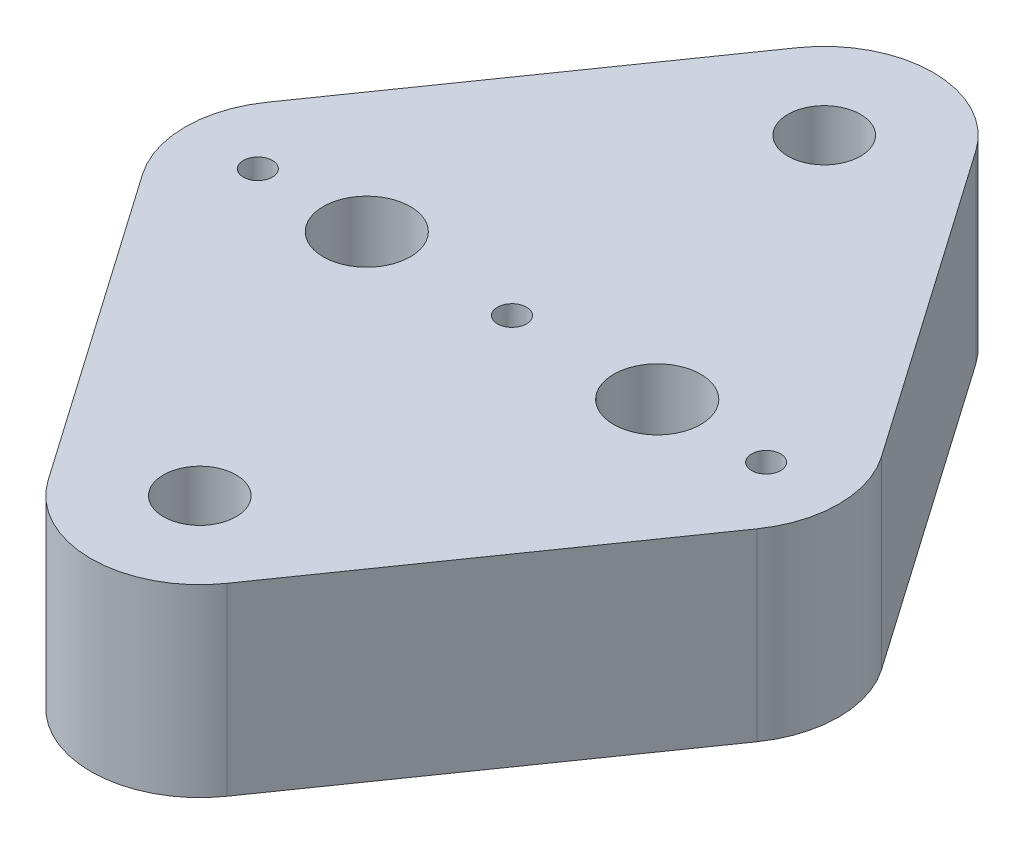
ISO-10303-21;
HEADER;
FILE_DESCRIPTION(('STEP AP214'),'2;1');
FILE_NAME('part.step','',(''),(''),'','','');
FILE_SCHEMA(('AUTOMOTIVE_DESIGN { 1 0 10303 214 1 1 1 1 }'));
ENDSEC;
DATA;
#1=APPLICATION_CONTEXT('core data for automotive mechanical design processes');
#2=APPLICATION_PROTOCOL_DEFINITION('international standard','automotive_design',2000,#1);
#3=PRODUCT_CONTEXT('',#1,'mechanical');
#4=PRODUCT('Part','Part','',(#3));
#5=PRODUCT_RELATED_PRODUCT_CATEGORY('part','',(#4));
#6=PRODUCT_DEFINITION_FORMATION('','',#4);
#7=PRODUCT_DEFINITION_CONTEXT('part definition',#1,'design');
#8=PRODUCT_DEFINITION('design','',#6,#7);
#9=PRODUCT_DEFINITION_SHAPE('','',#8);
#10=(LENGTH_UNIT() NAMED_UNIT(*) SI_UNIT(.MILLI.,.METRE.));
#11=(NAMED_UNIT(*) PLANE_ANGLE_UNIT() SI_UNIT($,.RADIAN.));
#12=(NAMED_UNIT(*) SI_UNIT($,.STERADIAN.) SOLID_ANGLE_UNIT());
#13=UNCERTAINTY_MEASURE_WITH_UNIT(LENGTH_MEASURE(1.E-05),#10,'distance_accuracy_value','');
#14=(GEOMETRIC_REPRESENTATION_CONTEXT(3) GLOBAL_UNCERTAINTY_ASSIGNED_CONTEXT((#13)) GLOBAL_UNIT_ASSIGNED_CONTEXT((#10,
#11,#12)) REPRESENTATION_CONTEXT('',''));
#15=CARTESIAN_POINT('',(0.,0.,0.));
#16=DIRECTION('',(0.,0.,1.));
#17=DIRECTION('',(1.,0.,0.));
#18=AXIS2_PLACEMENT_3D('',#15,#16,#17);
#19=CARTESIAN_POINT('',(0.,6.35,21.5));
#20=DIRECTION('',(0.,-1.,0.));
#21=DIRECTION('',(0.,0.,-1.));
#22=AXIS2_PLACEMENT_3D('',#19,#20,#21);
#23=PLANE('',#22);
#24=CARTESIAN_POINT('',(-17.5,6.35,0.));
#25=DIRECTION('',(0.,1.,0.));
#26=DIRECTION('',(0.,0.,1.));
#27=AXIS2_PLACEMENT_3D('',#24,#25,#26);
#28=CIRCLE('',#27,1.);
#29=CARTESIAN_POINT('',(-17.5,6.35,1.));
#30=VERTEX_POINT('',#29);
#31=EDGE_CURVE('E214',#30,#30,#28,.T.);
#32=ORIENTED_EDGE('',*,*,#31,.F.);
#33=EDGE_LOOP('',(#32));
#34=FACE_BOUND('',#33,.T.);
#35=CARTESIAN_POINT('',(17.5,6.35,0.));
#36=DIRECTION('',(0.,1.,0.));
#37=DIRECTION('',(0.,0.,1.));
#38=AXIS2_PLACEMENT_3D('',#35,#36,#37);
#39=CIRCLE('',#38,1.);
#40=CARTESIAN_POINT('',(17.5,6.35,1.));
#41=VERTEX_POINT('',#40);
#42=EDGE_CURVE('E208',#41,#41,#39,.T.);
#43=ORIENTED_EDGE('',*,*,#42,.F.);
#44=EDGE_LOOP('',(#43));
#45=FACE_BOUND('',#44,.T.);
#46=CARTESIAN_POINT('',(0.,6.35,0.));
#47=DIRECTION('',(0.,1.,0.));
#48=DIRECTION('',(0.,0.,1.));
#49=AXIS2_PLACEMENT_3D('',#46,#47,#48);
#50=CIRCLE('',#49,1.);
#51=CARTESIAN_POINT('',(0.,6.35,1.));
#52=VERTEX_POINT('',#51);
#53=EDGE_CURVE('E202',#52,#52,#50,.T.);
#54=ORIENTED_EDGE('',*,*,#53,.F.);
#55=EDGE_LOOP('',(#54));
#56=FACE_BOUND('',#55,.T.);
#57=CARTESIAN_POINT('',(0.,6.35,21.5));
#58=DIRECTION('',(0.,1.,0.));
#59=DIRECTION('',(0.,0.,-1.));
#60=AXIS2_PLACEMENT_3D('',#57,#58,#59);
#61=CIRCLE('',#60,7.5);
#62=CARTESIAN_POINT('',(-6.15095215725888,6.35,25.7913619701806));
#63=VERTEX_POINT('',#62);
#64=CARTESIAN_POINT('',(6.15095215725888,6.35,25.7913619701806));
#65=VERTEX_POINT('',#64);
#66=EDGE_CURVE('E144',#63,#65,#61,.T.);
#67=ORIENTED_EDGE('',*,*,#66,.T.);
#68=DIRECTION('',(0.572181596024081,0.,-0.820126954301183));
#69=VECTOR('',#68,1.);
#70=CARTESIAN_POINT('',(21.1509521572589,6.35,4.29136197018061));
#71=LINE('',#70,#69);
#72=CARTESIAN_POINT('',(21.1509521572589,6.35,4.29136197018061));
#73=VERTEX_POINT('',#72);
#74=EDGE_CURVE('E92',#65,#73,#71,.T.);
#75=ORIENTED_EDGE('',*,*,#74,.T.);
#76=CARTESIAN_POINT('',(15.,6.35,0.));
#77=DIRECTION('',(0.,1.,0.));
#78=DIRECTION('',(0.,0.,1.));
#79=AXIS2_PLACEMENT_3D('',#76,#77,#78);
#80=CIRCLE('',#79,7.5);
#81=CARTESIAN_POINT('',(21.1509521572589,6.35,-4.29136197018061));
#82=VERTEX_POINT('',#81);
#83=EDGE_CURVE('E159',#73,#82,#80,.T.);
#84=ORIENTED_EDGE('',*,*,#83,.T.);
#85=DIRECTION('',(-0.572181596024081,0.,-0.820126954301183));
#86=VECTOR('',#85,1.);
#87=CARTESIAN_POINT('',(6.15095215725888,6.35,-25.7913619701806));
#88=LINE('',#87,#86);
#89=CARTESIAN_POINT('',(6.15095215725888,6.35,-25.7913619701806));
#90=VERTEX_POINT('',#89);
#91=EDGE_CURVE('E172',#82,#90,#88,.T.);
#92=ORIENTED_EDGE('',*,*,#91,.T.);
#93=CARTESIAN_POINT('',(0.,6.35,-21.5));
#94=DIRECTION('',(0.,1.,0.));
#95=DIRECTION('',(0.,0.,-1.));
#96=AXIS2_PLACEMENT_3D('',#93,#94,#95);
#97=CIRCLE('',#96,7.5);
#98=CARTESIAN_POINT('',(-6.15095215725888,6.35,-25.7913619701806));
#99=VERTEX_POINT('',#98);
#100=EDGE_CURVE('E111',#90,#99,#97,.T.);
#101=ORIENTED_EDGE('',*,*,#100,.T.);
#102=DIRECTION('',(-0.572181596024081,0.,0.820126954301183));
#103=VECTOR('',#102,1.);
#104=CARTESIAN_POINT('',(-21.1509521572589,6.35,-4.29136197018061));
#105=LINE('',#104,#103);
#106=CARTESIAN_POINT('',(-21.1509521572589,6.35,-4.29136197018061));
#107=VERTEX_POINT('',#106);
#108=EDGE_CURVE('E105',#99,#107,#105,.T.);
#109=ORIENTED_EDGE('',*,*,#108,.T.);
#110=CARTESIAN_POINT('',(-15.,6.35,0.));
#111=DIRECTION('',(0.,1.,0.));
#112=DIRECTION('',(0.,0.,-1.));
#113=AXIS2_PLACEMENT_3D('',#110,#111,#112);
#114=CIRCLE('',#113,7.5);
#115=CARTESIAN_POINT('',(-21.1509521572589,6.35,4.29136197018061));
#116=VERTEX_POINT('',#115);
#117=EDGE_CURVE('E109',#107,#116,#114,.T.);
#118=ORIENTED_EDGE('',*,*,#117,.T.);
#119=DIRECTION('',(0.572181596024081,0.,0.820126954301183));
#120=VECTOR('',#119,1.);
#121=CARTESIAN_POINT('',(-6.15095215725888,6.35,25.7913619701806));
#122=LINE('',#121,#120);
#123=EDGE_CURVE('E49',#116,#63,#122,.T.);
#124=ORIENTED_EDGE('',*,*,#123,.T.);
#125=EDGE_LOOP('',(#67,#75,#84,#92,#101,#109,#118,#124));
#126=FACE_BOUND('',#125,.T.);
#127=CARTESIAN_POINT('',(0.,6.35,-21.5));
#128=DIRECTION('',(0.,1.,0.));
#129=DIRECTION('',(0.,0.,1.));
#130=AXIS2_PLACEMENT_3D('',#127,#128,#129);
#131=CIRCLE('',#130,2.5);
#132=CARTESIAN_POINT('',(0.,6.35,-19.));
#133=VERTEX_POINT('',#132);
#134=EDGE_CURVE('E133',#133,#133,#131,.T.);
#135=ORIENTED_EDGE('',*,*,#134,.F.);
#136=EDGE_LOOP('',(#135));
#137=FACE_BOUND('',#136,.T.);
#138=CARTESIAN_POINT('',(0.,6.35,21.5));
#139=DIRECTION('',(0.,1.,0.));
#140=DIRECTION('',(0.,0.,1.));
#141=AXIS2_PLACEMENT_3D('',#138,#139,#140);
#142=CIRCLE('',#141,2.5);
#143=CARTESIAN_POINT('',(0.,6.35,24.));
#144=VERTEX_POINT('',#143);
#145=EDGE_CURVE('E181',#144,#144,#142,.T.);
#146=ORIENTED_EDGE('',*,*,#145,.F.);
#147=EDGE_LOOP('',(#146));
#148=FACE_BOUND('',#147,.T.);
#149=CARTESIAN_POINT('',(-10.,6.35,0.));
#150=DIRECTION('',(0.,1.,0.));
#151=DIRECTION('',(0.,0.,1.));
#152=AXIS2_PLACEMENT_3D('',#149,#150,#151);
#153=CIRCLE('',#152,3.);
#154=CARTESIAN_POINT('',(-10.,6.35,3.));
#155=VERTEX_POINT('',#154);
#156=EDGE_CURVE('E187',#155,#155,#153,.T.);
#157=ORIENTED_EDGE('',*,*,#156,.F.);
#158=EDGE_LOOP('',(#157));
#159=FACE_BOUND('',#158,.T.);
#160=CARTESIAN_POINT('',(10.,6.35,0.));
#161=DIRECTION('',(0.,1.,0.));
#162=DIRECTION('',(0.,0.,1.));
#163=AXIS2_PLACEMENT_3D('',#160,#161,#162);
#164=CIRCLE('',#163,3.);
#165=CARTESIAN_POINT('',(10.,6.35,3.));
#166=VERTEX_POINT('',#165);
#167=EDGE_CURVE('E193',#166,#166,#164,.T.);
#168=ORIENTED_EDGE('',*,*,#167,.F.);
#169=EDGE_LOOP('',(#168));
#170=FACE_BOUND('',#169,.T.);
#171=ADVANCED_FACE('F32',(#34,#45,#56,#126,#137,#148,#159,#170),#23,.F.);
#172=CARTESIAN_POINT('',(0.,-6.35,21.5));
#173=DIRECTION('',(0.,-1.,0.));
#174=DIRECTION('',(0.,0.,-1.));
#175=AXIS2_PLACEMENT_3D('',#172,#173,#174);
#176=PLANE('',#175);
#177=CARTESIAN_POINT('',(-17.5,-6.35,0.));
#178=DIRECTION('',(0.,1.,0.));
#179=DIRECTION('',(0.,0.,1.));
#180=AXIS2_PLACEMENT_3D('',#177,#178,#179);
#181=CIRCLE('',#180,1.);
#182=CARTESIAN_POINT('',(-17.5,-6.35,1.));
#183=VERTEX_POINT('',#182);
#184=EDGE_CURVE('E199',#183,#183,#181,.T.);
#185=ORIENTED_EDGE('',*,*,#184,.T.);
#186=EDGE_LOOP('',(#185));
#187=FACE_BOUND('',#186,.T.);
#188=CARTESIAN_POINT('',(17.5,-6.35,0.));
#189=DIRECTION('',(0.,1.,0.));
#190=DIRECTION('',(0.,0.,1.));
#191=AXIS2_PLACEMENT_3D('',#188,#189,#190);
#192=CIRCLE('',#191,1.);
#193=CARTESIAN_POINT('',(17.5,-6.35,1.));
#194=VERTEX_POINT('',#193);
#195=EDGE_CURVE('E211',#194,#194,#192,.T.);
#196=ORIENTED_EDGE('',*,*,#195,.T.);
#197=EDGE_LOOP('',(#196));
#198=FACE_BOUND('',#197,.T.);
#199=CARTESIAN_POINT('',(0.,-6.35,0.));
#200=DIRECTION('',(0.,1.,0.));
#201=DIRECTION('',(0.,0.,1.));
#202=AXIS2_PLACEMENT_3D('',#199,#200,#201);
#203=CIRCLE('',#202,1.);
#204=CARTESIAN_POINT('',(0.,-6.35,1.));
#205=VERTEX_POINT('',#204);
#206=EDGE_CURVE('E205',#205,#205,#203,.T.);
#207=ORIENTED_EDGE('',*,*,#206,.T.);
#208=EDGE_LOOP('',(#207));
#209=FACE_BOUND('',#208,.T.);
#210=CARTESIAN_POINT('',(-10.,-6.35,0.));
#211=DIRECTION('',(0.,1.,0.));
#212=DIRECTION('',(0.,0.,1.));
#213=AXIS2_PLACEMENT_3D('',#210,#211,#212);
#214=CIRCLE('',#213,3.);
#215=CARTESIAN_POINT('',(-10.,-6.35,3.));
#216=VERTEX_POINT('',#215);
#217=EDGE_CURVE('E190',#216,#216,#214,.T.);
#218=ORIENTED_EDGE('',*,*,#217,.T.);
#219=EDGE_LOOP('',(#218));
#220=FACE_BOUND('',#219,.T.);
#221=CARTESIAN_POINT('',(0.,-6.35,-21.5));
#222=DIRECTION('',(0.,1.,0.));
#223=DIRECTION('',(0.,0.,1.));
#224=AXIS2_PLACEMENT_3D('',#221,#222,#223);
#225=CIRCLE('',#224,2.5);
#226=CARTESIAN_POINT('',(0.,-6.35,-19.));
#227=VERTEX_POINT('',#226);
#228=EDGE_CURVE('E178',#227,#227,#225,.T.);
#229=ORIENTED_EDGE('',*,*,#228,.T.);
#230=EDGE_LOOP('',(#229));
#231=FACE_BOUND('',#230,.T.);
#232=CARTESIAN_POINT('',(0.,-6.35,21.5));
#233=DIRECTION('',(0.,1.,0.));
#234=DIRECTION('',(0.,0.,-1.));
#235=AXIS2_PLACEMENT_3D('',#232,#233,#234);
#236=CIRCLE('',#235,7.5);
#237=CARTESIAN_POINT('',(-6.15095215725888,-6.35,25.7913619701806));
#238=VERTEX_POINT('',#237);
#239=CARTESIAN_POINT('',(6.15095215725888,-6.35,25.7913619701806));
#240=VERTEX_POINT('',#239);
#241=EDGE_CURVE('E129',#238,#240,#236,.T.);
#242=ORIENTED_EDGE('',*,*,#241,.F.);
#243=DIRECTION('',(0.572181596024081,0.,0.820126954301183));
#244=VECTOR('',#243,1.);
#245=CARTESIAN_POINT('',(-6.15095215725888,-6.35,25.7913619701806));
#246=LINE('',#245,#244);
#247=CARTESIAN_POINT('',(-21.1509521572589,-6.35,4.29136197018061));
#248=VERTEX_POINT('',#247);
#249=EDGE_CURVE('E84',#248,#238,#246,.T.);
#250=ORIENTED_EDGE('',*,*,#249,.F.);
#251=CARTESIAN_POINT('',(-15.,-6.35,0.));
#252=DIRECTION('',(0.,1.,0.));
#253=DIRECTION('',(0.,0.,-1.));
#254=AXIS2_PLACEMENT_3D('',#251,#252,#253);
#255=CIRCLE('',#254,7.5);
#256=CARTESIAN_POINT('',(-21.1509521572589,-6.35,-4.29136197018061));
#257=VERTEX_POINT('',#256);
#258=EDGE_CURVE('E78',#257,#248,#255,.T.);
#259=ORIENTED_EDGE('',*,*,#258,.F.);
#260=DIRECTION('',(-0.572181596024081,0.,0.820126954301183));
#261=VECTOR('',#260,1.);
#262=CARTESIAN_POINT('',(-21.1509521572589,-6.35,-4.29136197018061));
#263=LINE('',#262,#261);
#264=CARTESIAN_POINT('',(-6.15095215725888,-6.35,-25.7913619701806));
#265=VERTEX_POINT('',#264);
#266=EDGE_CURVE('E119',#265,#257,#263,.T.);
#267=ORIENTED_EDGE('',*,*,#266,.F.);
#268=CARTESIAN_POINT('',(0.,-6.35,-21.5));
#269=DIRECTION('',(0.,1.,0.));
#270=DIRECTION('',(0.,0.,-1.));
#271=AXIS2_PLACEMENT_3D('',#268,#269,#270);
#272=CIRCLE('',#271,7.5);
#273=CARTESIAN_POINT('',(6.15095215725888,-6.35,-25.7913619701806));
#274=VERTEX_POINT('',#273);
#275=EDGE_CURVE('E139',#274,#265,#272,.T.);
#276=ORIENTED_EDGE('',*,*,#275,.F.);
#277=DIRECTION('',(-0.572181596024081,0.,-0.820126954301183));
#278=VECTOR('',#277,1.);
#279=CARTESIAN_POINT('',(6.15095215725888,-6.35,-25.7913619701806));
#280=LINE('',#279,#278);
#281=CARTESIAN_POINT('',(21.1509521572589,-6.35,-4.29136197018061));
#282=VERTEX_POINT('',#281);
#283=EDGE_CURVE('E137',#282,#274,#280,.T.);
#284=ORIENTED_EDGE('',*,*,#283,.F.);
#285=CARTESIAN_POINT('',(15.,-6.35,0.));
#286=DIRECTION('',(0.,1.,0.));
#287=DIRECTION('',(0.,0.,1.));
#288=AXIS2_PLACEMENT_3D('',#285,#286,#287);
#289=CIRCLE('',#288,7.5);
#290=CARTESIAN_POINT('',(21.1509521572589,-6.35,4.29136197018061));
#291=VERTEX_POINT('',#290);
#292=EDGE_CURVE('E135',#291,#282,#289,.T.);
#293=ORIENTED_EDGE('',*,*,#292,.F.);
#294=DIRECTION('',(0.572181596024081,0.,-0.820126954301183));
#295=VECTOR('',#294,1.);
#296=CARTESIAN_POINT('',(21.1509521572589,-6.35,4.29136197018061));
#297=LINE('',#296,#295);
#298=EDGE_CURVE('E132',#240,#291,#297,.T.);
#299=ORIENTED_EDGE('',*,*,#298,.F.);
#300=EDGE_LOOP('',(#242,#250,#259,#267,#276,#284,#293,#299));
#301=FACE_BOUND('',#300,.T.);
#302=CARTESIAN_POINT('',(0.,-6.35,21.5));
#303=DIRECTION('',(0.,1.,0.));
#304=DIRECTION('',(0.,0.,1.));
#305=AXIS2_PLACEMENT_3D('',#302,#303,#304);
#306=CIRCLE('',#305,2.5);
#307=CARTESIAN_POINT('',(0.,-6.35,24.));
#308=VERTEX_POINT('',#307);
#309=EDGE_CURVE('E184',#308,#308,#306,.T.);
#310=ORIENTED_EDGE('',*,*,#309,.T.);
#311=EDGE_LOOP('',(#310));
#312=FACE_BOUND('',#311,.T.);
#313=CARTESIAN_POINT('',(10.,-6.35,0.));
#314=DIRECTION('',(0.,1.,0.));
#315=DIRECTION('',(0.,0.,1.));
#316=AXIS2_PLACEMENT_3D('',#313,#314,#315);
#317=CIRCLE('',#316,3.);
#318=CARTESIAN_POINT('',(10.,-6.35,3.));
#319=VERTEX_POINT('',#318);
#320=EDGE_CURVE('E196',#319,#319,#317,.T.);
#321=ORIENTED_EDGE('',*,*,#320,.T.);
#322=EDGE_LOOP('',(#321));
#323=FACE_BOUND('',#322,.T.);
#324=ADVANCED_FACE('F163',(#187,#198,#209,#220,#231,#301,#312,#323),#176,.T.);
#325=CARTESIAN_POINT('',(0.,6.35,21.5));
#326=DIRECTION('',(0.,-1.,0.));
#327=DIRECTION('',(0.,0.,-1.));
#328=AXIS2_PLACEMENT_3D('',#325,#326,#327);
#329=CYLINDRICAL_SURFACE('',#328,7.5);
#330=ORIENTED_EDGE('',*,*,#241,.T.);
#331=DIRECTION('',(0.,-1.,0.));
#332=VECTOR('',#331,1.);
#333=CARTESIAN_POINT('',(6.15095215725888,6.35,25.7913619701806));
#334=LINE('',#333,#332);
#335=EDGE_CURVE('E11',#65,#240,#334,.T.);
#336=ORIENTED_EDGE('',*,*,#335,.F.);
#337=ORIENTED_EDGE('',*,*,#66,.F.);
#338=DIRECTION('',(0.,-1.,0.));
#339=VECTOR('',#338,1.);
#340=CARTESIAN_POINT('',(-6.15095215725888,6.35,25.7913619701806));
#341=LINE('',#340,#339);
#342=EDGE_CURVE('E125',#63,#238,#341,.T.);
#343=ORIENTED_EDGE('',*,*,#342,.T.);
#344=EDGE_LOOP('',(#330,#336,#337,#343));
#345=FACE_BOUND('',#344,.T.);
#346=ADVANCED_FACE('F34',(#345),#329,.T.);
#347=CARTESIAN_POINT('',(21.1509521572589,6.35,4.29136197018061));
#348=DIRECTION('',(-0.820126954301183,0.,-0.572181596024081));
#349=DIRECTION('',(-0.572181596024081,0.,0.820126954301183));
#350=AXIS2_PLACEMENT_3D('',#347,#348,#349);
#351=PLANE('',#350);
#352=ORIENTED_EDGE('',*,*,#298,.T.);
#353=DIRECTION('',(0.,-1.,0.));
#354=VECTOR('',#353,1.);
#355=CARTESIAN_POINT('',(21.1509521572589,6.35,4.29136197018061));
#356=LINE('',#355,#354);
#357=EDGE_CURVE('E41',#73,#291,#356,.T.);
#358=ORIENTED_EDGE('',*,*,#357,.F.);
#359=ORIENTED_EDGE('',*,*,#74,.F.);
#360=ORIENTED_EDGE('',*,*,#335,.T.);
#361=EDGE_LOOP('',(#352,#358,#359,#360));
#362=FACE_BOUND('',#361,.T.);
#363=ADVANCED_FACE('F277',(#362),#351,.F.);
#364=CARTESIAN_POINT('',(15.,6.35,0.));
#365=DIRECTION('',(0.,-1.,0.));
#366=DIRECTION('',(0.,0.,-1.));
#367=AXIS2_PLACEMENT_3D('',#364,#365,#366);
#368=CYLINDRICAL_SURFACE('',#367,7.5);
#369=ORIENTED_EDGE('',*,*,#292,.T.);
#370=DIRECTION('',(0.,-1.,0.));
#371=VECTOR('',#370,1.);
#372=CARTESIAN_POINT('',(21.1509521572589,6.35,-4.29136197018061));
#373=LINE('',#372,#371);
#374=EDGE_CURVE('E151',#82,#282,#373,.T.);
#375=ORIENTED_EDGE('',*,*,#374,.F.);
#376=ORIENTED_EDGE('',*,*,#83,.F.);
#377=ORIENTED_EDGE('',*,*,#357,.T.);
#378=EDGE_LOOP('',(#369,#375,#376,#377));
#379=FACE_BOUND('',#378,.T.);
#380=ADVANCED_FACE('F157',(#379),#368,.T.);
#381=CARTESIAN_POINT('',(6.15095215725888,6.35,-25.7913619701806));
#382=DIRECTION('',(-0.820126954301183,0.,0.572181596024081));
#383=DIRECTION('',(0.572181596024081,0.,0.820126954301183));
#384=AXIS2_PLACEMENT_3D('',#381,#382,#383);
#385=PLANE('',#384);
#386=ORIENTED_EDGE('',*,*,#283,.T.);
#387=DIRECTION('',(0.,-1.,0.));
#388=VECTOR('',#387,1.);
#389=CARTESIAN_POINT('',(6.15095215725888,6.35,-25.7913619701806));
#390=LINE('',#389,#388);
#391=EDGE_CURVE('E148',#90,#274,#390,.T.);
#392=ORIENTED_EDGE('',*,*,#391,.F.);
#393=ORIENTED_EDGE('',*,*,#91,.F.);
#394=ORIENTED_EDGE('',*,*,#374,.T.);
#395=EDGE_LOOP('',(#386,#392,#393,#394));
#396=FACE_BOUND('',#395,.T.);
#397=ADVANCED_FACE('F168',(#396),#385,.F.);
#398=CARTESIAN_POINT('',(0.,6.35,-21.5));
#399=DIRECTION('',(0.,-1.,0.));
#400=DIRECTION('',(0.,0.,-1.));
#401=AXIS2_PLACEMENT_3D('',#398,#399,#400);
#402=CYLINDRICAL_SURFACE('',#401,7.5);
#403=ORIENTED_EDGE('',*,*,#275,.T.);
#404=DIRECTION('',(0.,-1.,0.));
#405=VECTOR('',#404,1.);
#406=CARTESIAN_POINT('',(-6.15095215725888,6.35,-25.7913619701806));
#407=LINE('',#406,#405);
#408=EDGE_CURVE('E120',#99,#265,#407,.T.);
#409=ORIENTED_EDGE('',*,*,#408,.F.);
#410=ORIENTED_EDGE('',*,*,#100,.F.);
#411=ORIENTED_EDGE('',*,*,#391,.T.);
#412=EDGE_LOOP('',(#403,#409,#410,#411));
#413=FACE_BOUND('',#412,.T.);
#414=ADVANCED_FACE('F171',(#413),#402,.T.);
#415=CARTESIAN_POINT('',(-21.1509521572589,6.35,-4.29136197018061));
#416=DIRECTION('',(0.820126954301183,0.,0.572181596024081));
#417=DIRECTION('',(0.572181596024081,0.,-0.820126954301183));
#418=AXIS2_PLACEMENT_3D('',#415,#416,#417);
#419=PLANE('',#418);
#420=ORIENTED_EDGE('',*,*,#266,.T.);
#421=DIRECTION('',(0.,-1.,0.));
#422=VECTOR('',#421,1.);
#423=CARTESIAN_POINT('',(-21.1509521572589,6.35,-4.29136197018061));
#424=LINE('',#423,#422);
#425=EDGE_CURVE('E116',#107,#257,#424,.T.);
#426=ORIENTED_EDGE('',*,*,#425,.F.);
#427=ORIENTED_EDGE('',*,*,#108,.F.);
#428=ORIENTED_EDGE('',*,*,#408,.T.);
#429=EDGE_LOOP('',(#420,#426,#427,#428));
#430=FACE_BOUND('',#429,.T.);
#431=ADVANCED_FACE('F117',(#430),#419,.F.);
#432=CARTESIAN_POINT('',(-15.,6.35,0.));
#433=DIRECTION('',(0.,-1.,0.));
#434=DIRECTION('',(0.,0.,-1.));
#435=AXIS2_PLACEMENT_3D('',#432,#433,#434);
#436=CYLINDRICAL_SURFACE('',#435,7.5);
#437=ORIENTED_EDGE('',*,*,#258,.T.);
#438=DIRECTION('',(0.,-1.,0.));
#439=VECTOR('',#438,1.);
#440=CARTESIAN_POINT('',(-21.1509521572589,6.35,4.29136197018061));
#441=LINE('',#440,#439);
#442=EDGE_CURVE('E121',#116,#248,#441,.T.);
#443=ORIENTED_EDGE('',*,*,#442,.F.);
#444=ORIENTED_EDGE('',*,*,#117,.F.);
#445=ORIENTED_EDGE('',*,*,#425,.T.);
#446=EDGE_LOOP('',(#437,#443,#444,#445));
#447=FACE_BOUND('',#446,.T.);
#448=ADVANCED_FACE('F123',(#447),#436,.T.);
#449=CARTESIAN_POINT('',(-6.15095215725888,6.35,25.7913619701806));
#450=DIRECTION('',(0.820126954301183,0.,-0.572181596024081));
#451=DIRECTION('',(-0.572181596024081,0.,-0.820126954301183));
#452=AXIS2_PLACEMENT_3D('',#449,#450,#451);
#453=PLANE('',#452);
#454=ORIENTED_EDGE('',*,*,#249,.T.);
#455=ORIENTED_EDGE('',*,*,#342,.F.);
#456=ORIENTED_EDGE('',*,*,#123,.F.);
#457=ORIENTED_EDGE('',*,*,#442,.T.);
#458=EDGE_LOOP('',(#454,#455,#456,#457));
#459=FACE_BOUND('',#458,.T.);
#460=ADVANCED_FACE('F261',(#459),#453,.F.);
#461=CARTESIAN_POINT('',(0.,6.35,-21.5));
#462=DIRECTION('',(0.,-1.,0.));
#463=DIRECTION('',(0.,0.,-1.));
#464=AXIS2_PLACEMENT_3D('',#461,#462,#463);
#465=CYLINDRICAL_SURFACE('',#464,2.5);
#466=ORIENTED_EDGE('',*,*,#134,.T.);
#467=EDGE_LOOP('',(#466));
#468=FACE_BOUND('',#467,.T.);
#469=ORIENTED_EDGE('',*,*,#228,.F.);
#470=EDGE_LOOP('',(#469));
#471=FACE_BOUND('',#470,.T.);
#472=ADVANCED_FACE('F258',(#468,#471),#465,.F.);
#473=CARTESIAN_POINT('',(0.,6.35,21.5));
#474=DIRECTION('',(0.,-1.,0.));
#475=DIRECTION('',(0.,0.,-1.));
#476=AXIS2_PLACEMENT_3D('',#473,#474,#475);
#477=CYLINDRICAL_SURFACE('',#476,2.5);
#478=ORIENTED_EDGE('',*,*,#145,.T.);
#479=EDGE_LOOP('',(#478));
#480=FACE_BOUND('',#479,.T.);
#481=ORIENTED_EDGE('',*,*,#309,.F.);
#482=EDGE_LOOP('',(#481));
#483=FACE_BOUND('',#482,.T.);
#484=ADVANCED_FACE('F254',(#480,#483),#477,.F.);
#485=CARTESIAN_POINT('',(-10.,6.35,0.));
#486=DIRECTION('',(0.,-1.,0.));
#487=DIRECTION('',(0.,0.,-1.));
#488=AXIS2_PLACEMENT_3D('',#485,#486,#487);
#489=CYLINDRICAL_SURFACE('',#488,3.);
#490=ORIENTED_EDGE('',*,*,#156,.T.);
#491=EDGE_LOOP('',(#490));
#492=FACE_BOUND('',#491,.T.);
#493=ORIENTED_EDGE('',*,*,#217,.F.);
#494=EDGE_LOOP('',(#493));
#495=FACE_BOUND('',#494,.T.);
#496=ADVANCED_FACE('F247',(#492,#495),#489,.F.);
#497=CARTESIAN_POINT('',(10.,6.35,0.));
#498=DIRECTION('',(0.,-1.,0.));
#499=DIRECTION('',(0.,0.,-1.));
#500=AXIS2_PLACEMENT_3D('',#497,#498,#499);
#501=CYLINDRICAL_SURFACE('',#500,3.);
#502=ORIENTED_EDGE('',*,*,#167,.T.);
#503=EDGE_LOOP('',(#502));
#504=FACE_BOUND('',#503,.T.);
#505=ORIENTED_EDGE('',*,*,#320,.F.);
#506=EDGE_LOOP('',(#505));
#507=FACE_BOUND('',#506,.T.);
#508=ADVANCED_FACE('F238',(#504,#507),#501,.F.);
#509=CARTESIAN_POINT('',(0.,-6.35,0.));
#510=DIRECTION('',(0.,1.,0.));
#511=DIRECTION('',(0.,0.,1.));
#512=AXIS2_PLACEMENT_3D('',#509,#510,#511);
#513=CYLINDRICAL_SURFACE('',#512,1.);
#514=ORIENTED_EDGE('',*,*,#206,.F.);
#515=EDGE_LOOP('',(#514));
#516=FACE_BOUND('',#515,.T.);
#517=ORIENTED_EDGE('',*,*,#53,.T.);
#518=EDGE_LOOP('',(#517));
#519=FACE_BOUND('',#518,.T.);
#520=ADVANCED_FACE('F236',(#516,#519),#513,.F.);
#521=CARTESIAN_POINT('',(17.5,-6.35,0.));
#522=DIRECTION('',(0.,1.,0.));
#523=DIRECTION('',(0.,0.,1.));
#524=AXIS2_PLACEMENT_3D('',#521,#522,#523);
#525=CYLINDRICAL_SURFACE('',#524,1.);
#526=ORIENTED_EDGE('',*,*,#195,.F.);
#527=EDGE_LOOP('',(#526));
#528=FACE_BOUND('',#527,.T.);
#529=ORIENTED_EDGE('',*,*,#42,.T.);
#530=EDGE_LOOP('',(#529));
#531=FACE_BOUND('',#530,.T.);
#532=ADVANCED_FACE('F225',(#528,#531),#525,.F.);
#533=CARTESIAN_POINT('',(-17.5,-6.35,0.));
#534=DIRECTION('',(0.,1.,0.));
#535=DIRECTION('',(0.,0.,1.));
#536=AXIS2_PLACEMENT_3D('',#533,#534,#535);
#537=CYLINDRICAL_SURFACE('',#536,1.);
#538=ORIENTED_EDGE('',*,*,#184,.F.);
#539=EDGE_LOOP('',(#538));
#540=FACE_BOUND('',#539,.T.);
#541=ORIENTED_EDGE('',*,*,#31,.T.);
#542=EDGE_LOOP('',(#541));
#543=FACE_BOUND('',#542,.T.);
#544=ADVANCED_FACE('F222',(#540,#543),#537,.F.);
#545=CLOSED_SHELL('',(#171,#324,#346,#363,#380,#397,#414,#431,#448,#460,#472,#484,#496,#508,
#520,#532,#544));
#546=MANIFOLD_SOLID_BREP('B2',#545);
#547=ADVANCED_BREP_SHAPE_REPRESENTATION('',(#18,#546),#14);
#548=SHAPE_DEFINITION_REPRESENTATION(#9,#547);
ENDSEC;
END-ISO-10303-21;
